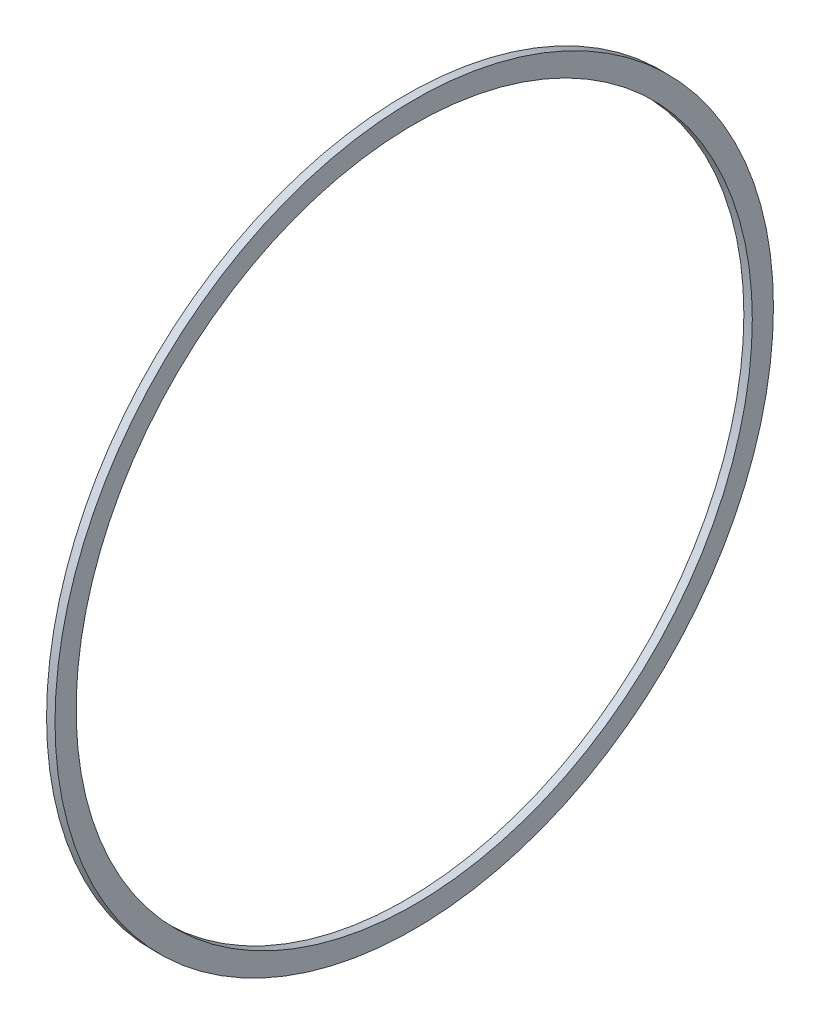
ISO-10303-21;
HEADER;
FILE_DESCRIPTION(('STEP AP214'),'2;1');
FILE_NAME('part.step','',(''),(''),'','','');
FILE_SCHEMA(('AUTOMOTIVE_DESIGN { 1 0 10303 214 1 1 1 1 }'));
ENDSEC;
DATA;
#1=APPLICATION_CONTEXT('core data for automotive mechanical design processes');
#2=APPLICATION_PROTOCOL_DEFINITION('international standard','automotive_design',2000,#1);
#3=PRODUCT_CONTEXT('',#1,'mechanical');
#4=PRODUCT('Part','Part','',(#3));
#5=PRODUCT_RELATED_PRODUCT_CATEGORY('part','',(#4));
#6=PRODUCT_DEFINITION_FORMATION('','',#4);
#7=PRODUCT_DEFINITION_CONTEXT('part definition',#1,'design');
#8=PRODUCT_DEFINITION('design','',#6,#7);
#9=PRODUCT_DEFINITION_SHAPE('','',#8);
#10=(LENGTH_UNIT() NAMED_UNIT(*) SI_UNIT(.MILLI.,.METRE.));
#11=(NAMED_UNIT(*) PLANE_ANGLE_UNIT() SI_UNIT($,.RADIAN.));
#12=(NAMED_UNIT(*) SI_UNIT($,.STERADIAN.) SOLID_ANGLE_UNIT());
#13=UNCERTAINTY_MEASURE_WITH_UNIT(LENGTH_MEASURE(1.E-05),#10,'distance_accuracy_value','');
#14=(GEOMETRIC_REPRESENTATION_CONTEXT(3) GLOBAL_UNCERTAINTY_ASSIGNED_CONTEXT((#13)) GLOBAL_UNIT_ASSIGNED_CONTEXT((#10,
#11,#12)) REPRESENTATION_CONTEXT('',''));
#15=CARTESIAN_POINT('',(0.,0.,0.));
#16=DIRECTION('',(0.,0.,1.));
#17=DIRECTION('',(1.,0.,0.));
#18=AXIS2_PLACEMENT_3D('',#15,#16,#17);
#19=CARTESIAN_POINT('',(1.,0.,0.));
#20=DIRECTION('',(1.,0.,0.));
#21=DIRECTION('',(0.,0.,-1.));
#22=AXIS2_PLACEMENT_3D('',#19,#20,#21);
#23=PLANE('',#22);
#24=CARTESIAN_POINT('',(1.,0.,0.));
#25=DIRECTION('',(1.,0.,0.));
#26=DIRECTION('',(0.,0.,-1.));
#27=AXIS2_PLACEMENT_3D('',#24,#25,#26);
#28=CIRCLE('',#27,42.5);
#29=CARTESIAN_POINT('',(1.,0.,-42.5));
#30=VERTEX_POINT('',#29);
#31=EDGE_CURVE('E10',#30,#30,#28,.T.);
#32=ORIENTED_EDGE('',*,*,#31,.T.);
#33=EDGE_LOOP('',(#32));
#34=FACE_BOUND('',#33,.T.);
#35=CARTESIAN_POINT('',(1.,0.,0.));
#36=DIRECTION('',(1.,0.,0.));
#37=DIRECTION('',(0.,0.,-1.));
#38=AXIS2_PLACEMENT_3D('',#35,#36,#37);
#39=CIRCLE('',#38,40.);
#40=CARTESIAN_POINT('',(1.,0.,-40.));
#41=VERTEX_POINT('',#40);
#42=EDGE_CURVE('E41',#41,#41,#39,.T.);
#43=ORIENTED_EDGE('',*,*,#42,.F.);
#44=EDGE_LOOP('',(#43));
#45=FACE_BOUND('',#44,.T.);
#46=ADVANCED_FACE('F30',(#34,#45),#23,.T.);
#47=CARTESIAN_POINT('',(0.,0.,0.));
#48=DIRECTION('',(1.,0.,0.));
#49=DIRECTION('',(0.,0.,-1.));
#50=AXIS2_PLACEMENT_3D('',#47,#48,#49);
#51=PLANE('',#50);
#52=CARTESIAN_POINT('',(0.,0.,0.));
#53=DIRECTION('',(1.,0.,0.));
#54=DIRECTION('',(0.,0.,-1.));
#55=AXIS2_PLACEMENT_3D('',#52,#53,#54);
#56=CIRCLE('',#55,42.5);
#57=CARTESIAN_POINT('',(0.,0.,-42.5));
#58=VERTEX_POINT('',#57);
#59=EDGE_CURVE('E34',#58,#58,#56,.T.);
#60=ORIENTED_EDGE('',*,*,#59,.F.);
#61=EDGE_LOOP('',(#60));
#62=FACE_BOUND('',#61,.T.);
#63=CARTESIAN_POINT('',(0.,0.,0.));
#64=DIRECTION('',(1.,0.,0.));
#65=DIRECTION('',(0.,0.,-1.));
#66=AXIS2_PLACEMENT_3D('',#63,#64,#65);
#67=CIRCLE('',#66,40.);
#68=CARTESIAN_POINT('',(0.,0.,-40.));
#69=VERTEX_POINT('',#68);
#70=EDGE_CURVE('E43',#69,#69,#67,.T.);
#71=ORIENTED_EDGE('',*,*,#70,.T.);
#72=EDGE_LOOP('',(#71));
#73=FACE_BOUND('',#72,.T.);
#74=ADVANCED_FACE('F53',(#62,#73),#51,.F.);
#75=CARTESIAN_POINT('',(1.,0.,0.));
#76=DIRECTION('',(-1.,0.,0.));
#77=DIRECTION('',(0.,0.,1.));
#78=AXIS2_PLACEMENT_3D('',#75,#76,#77);
#79=CYLINDRICAL_SURFACE('',#78,42.5);
#80=ORIENTED_EDGE('',*,*,#31,.F.);
#81=EDGE_LOOP('',(#80));
#82=FACE_BOUND('',#81,.T.);
#83=ORIENTED_EDGE('',*,*,#59,.T.);
#84=EDGE_LOOP('',(#83));
#85=FACE_BOUND('',#84,.T.);
#86=ADVANCED_FACE('F32',(#82,#85),#79,.T.);
#87=CARTESIAN_POINT('',(1.,0.,0.));
#88=DIRECTION('',(-1.,0.,0.));
#89=DIRECTION('',(0.,0.,1.));
#90=AXIS2_PLACEMENT_3D('',#87,#88,#89);
#91=CYLINDRICAL_SURFACE('',#90,40.);
#92=ORIENTED_EDGE('',*,*,#42,.T.);
#93=EDGE_LOOP('',(#92));
#94=FACE_BOUND('',#93,.T.);
#95=ORIENTED_EDGE('',*,*,#70,.F.);
#96=EDGE_LOOP('',(#95));
#97=FACE_BOUND('',#96,.T.);
#98=ADVANCED_FACE('F49',(#94,#97),#91,.F.);
#99=CLOSED_SHELL('',(#46,#74,#86,#98));
#100=MANIFOLD_SOLID_BREP('B2',#99);
#101=ADVANCED_BREP_SHAPE_REPRESENTATION('',(#18,#100),#14);
#102=SHAPE_DEFINITION_REPRESENTATION(#9,#101);
ENDSEC;
END-ISO-10303-21;
